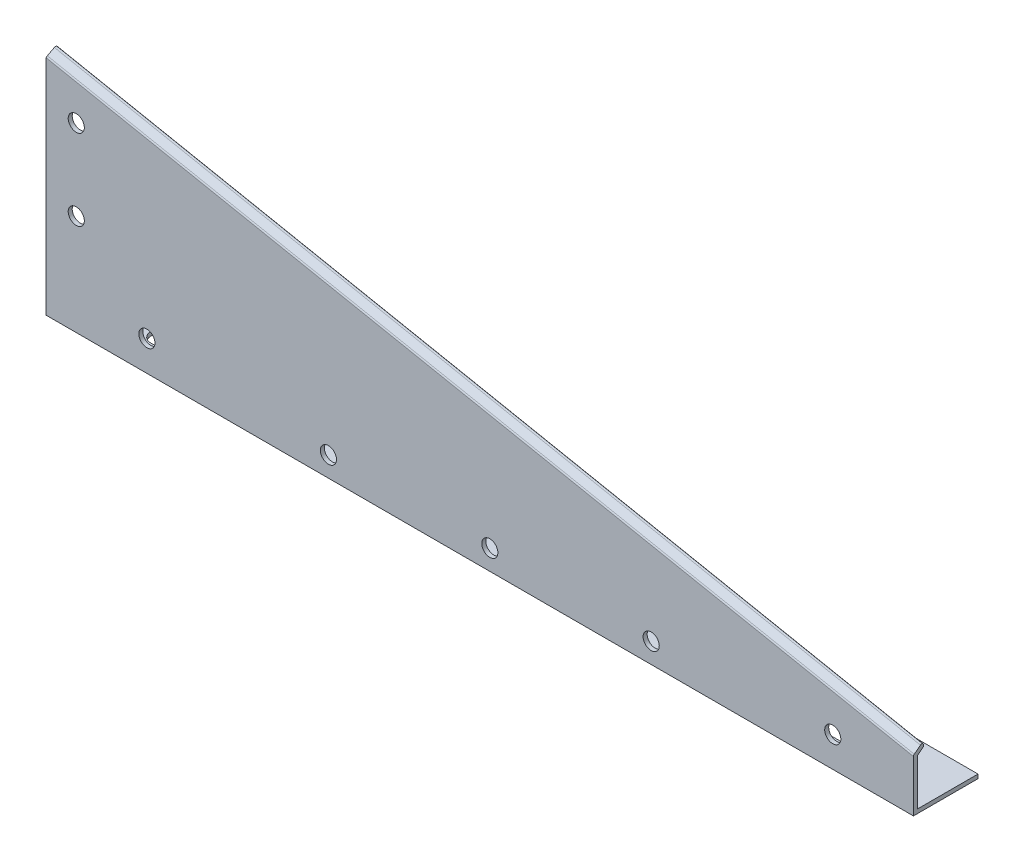
ISO-10303-21;
HEADER;
FILE_DESCRIPTION(('STEP AP214'),'2;1');
FILE_NAME('part.step','',(''),(''),'','','');
FILE_SCHEMA(('AUTOMOTIVE_DESIGN { 1 0 10303 214 1 1 1 1 }'));
ENDSEC;
DATA;
#1=APPLICATION_CONTEXT('core data for automotive mechanical design processes');
#2=APPLICATION_PROTOCOL_DEFINITION('international standard','automotive_design',2000,#1);
#3=PRODUCT_CONTEXT('',#1,'mechanical');
#4=PRODUCT('Part','Part','',(#3));
#5=PRODUCT_RELATED_PRODUCT_CATEGORY('part','',(#4));
#6=PRODUCT_DEFINITION_FORMATION('','',#4);
#7=PRODUCT_DEFINITION_CONTEXT('part definition',#1,'design');
#8=PRODUCT_DEFINITION('design','',#6,#7);
#9=PRODUCT_DEFINITION_SHAPE('','',#8);
#10=(LENGTH_UNIT() NAMED_UNIT(*) SI_UNIT(.MILLI.,.METRE.));
#11=(NAMED_UNIT(*) PLANE_ANGLE_UNIT() SI_UNIT($,.RADIAN.));
#12=(NAMED_UNIT(*) SI_UNIT($,.STERADIAN.) SOLID_ANGLE_UNIT());
#13=UNCERTAINTY_MEASURE_WITH_UNIT(LENGTH_MEASURE(1.E-05),#10,'distance_accuracy_value','');
#14=(GEOMETRIC_REPRESENTATION_CONTEXT(3) GLOBAL_UNCERTAINTY_ASSIGNED_CONTEXT((#13)) GLOBAL_UNIT_ASSIGNED_CONTEXT((#10,
#11,#12)) REPRESENTATION_CONTEXT('',''));
#15=CARTESIAN_POINT('',(0.,0.,0.));
#16=DIRECTION('',(0.,0.,1.));
#17=DIRECTION('',(1.,0.,0.));
#18=AXIS2_PLACEMENT_3D('',#15,#16,#17);
#19=CARTESIAN_POINT('',(0.,0.,0.));
#20=DIRECTION('',(0.,0.,1.));
#21=DIRECTION('',(1.,0.,0.));
#22=AXIS2_PLACEMENT_3D('',#19,#20,#21);
#23=PLANE('',#22);
#24=CARTESIAN_POINT('',(140.,10.,0.));
#25=DIRECTION('',(0.,0.,1.));
#26=DIRECTION('',(1.,0.,0.));
#27=AXIS2_PLACEMENT_3D('',#24,#25,#26);
#28=CIRCLE('',#27,3.99999999999999);
#29=CARTESIAN_POINT('',(144.,10.,0.));
#30=VERTEX_POINT('',#29);
#31=EDGE_CURVE('E214',#30,#30,#28,.T.);
#32=ORIENTED_EDGE('',*,*,#31,.T.);
#33=EDGE_LOOP('',(#32));
#34=FACE_BOUND('',#33,.T.);
#35=CARTESIAN_POINT('',(220.,10.,0.));
#36=DIRECTION('',(0.,0.,1.));
#37=DIRECTION('',(1.,0.,0.));
#38=AXIS2_PLACEMENT_3D('',#35,#36,#37);
#39=CIRCLE('',#38,3.99999999999999);
#40=CARTESIAN_POINT('',(224.,10.,0.));
#41=VERTEX_POINT('',#40);
#42=EDGE_CURVE('E211',#41,#41,#39,.T.);
#43=ORIENTED_EDGE('',*,*,#42,.T.);
#44=EDGE_LOOP('',(#43));
#45=FACE_BOUND('',#44,.T.);
#46=CARTESIAN_POINT('',(300.,10.,0.));
#47=DIRECTION('',(0.,0.,1.));
#48=DIRECTION('',(1.,0.,0.));
#49=AXIS2_PLACEMENT_3D('',#46,#47,#48);
#50=CIRCLE('',#49,3.99999999999999);
#51=CARTESIAN_POINT('',(304.,10.,0.));
#52=VERTEX_POINT('',#51);
#53=EDGE_CURVE('E201',#52,#52,#50,.T.);
#54=ORIENTED_EDGE('',*,*,#53,.T.);
#55=EDGE_LOOP('',(#54));
#56=FACE_BOUND('',#55,.T.);
#57=CARTESIAN_POINT('',(15.,90.,0.));
#58=DIRECTION('',(0.,0.,1.));
#59=DIRECTION('',(1.,0.,0.));
#60=AXIS2_PLACEMENT_3D('',#57,#58,#59);
#61=CIRCLE('',#60,4.);
#62=CARTESIAN_POINT('',(19.,90.,0.));
#63=VERTEX_POINT('',#62);
#64=EDGE_CURVE('E238',#63,#63,#61,.T.);
#65=ORIENTED_EDGE('',*,*,#64,.T.);
#66=EDGE_LOOP('',(#65));
#67=FACE_BOUND('',#66,.T.);
#68=CARTESIAN_POINT('',(390.,15.,0.));
#69=DIRECTION('',(0.,0.,1.));
#70=DIRECTION('',(1.,0.,0.));
#71=AXIS2_PLACEMENT_3D('',#68,#69,#70);
#72=CIRCLE('',#71,3.99999999999999);
#73=CARTESIAN_POINT('',(394.,15.,0.));
#74=VERTEX_POINT('',#73);
#75=EDGE_CURVE('E235',#74,#74,#72,.T.);
#76=ORIENTED_EDGE('',*,*,#75,.T.);
#77=EDGE_LOOP('',(#76));
#78=FACE_BOUND('',#77,.T.);
#79=CARTESIAN_POINT('',(50.,15.,0.));
#80=DIRECTION('',(0.,0.,1.));
#81=DIRECTION('',(1.,0.,0.));
#82=AXIS2_PLACEMENT_3D('',#79,#80,#81);
#83=CIRCLE('',#82,4.00000000000001);
#84=CARTESIAN_POINT('',(54.,15.,0.));
#85=VERTEX_POINT('',#84);
#86=EDGE_CURVE('E232',#85,#85,#83,.T.);
#87=ORIENTED_EDGE('',*,*,#86,.T.);
#88=EDGE_LOOP('',(#87));
#89=FACE_BOUND('',#88,.T.);
#90=CARTESIAN_POINT('',(15.,50.,0.));
#91=DIRECTION('',(0.,0.,1.));
#92=DIRECTION('',(1.,0.,0.));
#93=AXIS2_PLACEMENT_3D('',#90,#91,#92);
#94=CIRCLE('',#93,4.00000000000001);
#95=CARTESIAN_POINT('',(19.,50.,0.));
#96=VERTEX_POINT('',#95);
#97=EDGE_CURVE('E229',#96,#96,#94,.T.);
#98=ORIENTED_EDGE('',*,*,#97,.T.);
#99=EDGE_LOOP('',(#98));
#100=FACE_BOUND('',#99,.T.);
#101=DIRECTION('',(0.,-1.,0.));
#102=VECTOR('',#101,1.);
#103=CARTESIAN_POINT('',(0.,110.,0.));
#104=LINE('',#103,#102);
#105=CARTESIAN_POINT('',(0.,109.490324815257,0.));
#106=VERTEX_POINT('',#105);
#107=CARTESIAN_POINT('',(0.,2.,0.));
#108=VERTEX_POINT('',#107);
#109=EDGE_CURVE('E324',#106,#108,#104,.T.);
#110=ORIENTED_EDGE('',*,*,#109,.F.);
#111=DIRECTION('',(-0.981016959364532,0.193921957083687,0.));
#112=VECTOR('',#111,1.);
#113=CARTESIAN_POINT('',(429.903039021458,24.5094915203177,0.));
#114=LINE('',#113,#112);
#115=CARTESIAN_POINT('',(430.,24.4903248152571,0.));
#116=VERTEX_POINT('',#115);
#117=EDGE_CURVE('E343',#106,#116,#114,.F.);
#118=ORIENTED_EDGE('',*,*,#117,.T.);
#119=DIRECTION('',(0.,1.,0.));
#120=VECTOR('',#119,1.);
#121=CARTESIAN_POINT('',(430.,0.,0.));
#122=LINE('',#121,#120);
#123=CARTESIAN_POINT('',(430.,2.,0.));
#124=VERTEX_POINT('',#123);
#125=EDGE_CURVE('E329',#124,#116,#122,.T.);
#126=ORIENTED_EDGE('',*,*,#125,.F.);
#127=DIRECTION('',(1.,0.,0.));
#128=VECTOR('',#127,1.);
#129=CARTESIAN_POINT('',(430.,2.,0.));
#130=LINE('',#129,#128);
#131=EDGE_CURVE('E305',#108,#124,#130,.T.);
#132=ORIENTED_EDGE('',*,*,#131,.F.);
#133=EDGE_LOOP('',(#110,#118,#126,#132));
#134=FACE_BOUND('',#133,.T.);
#135=ADVANCED_FACE('F33',(#34,#45,#56,#67,#78,#89,#100,#134),#23,.F.);
#136=CARTESIAN_POINT('',(0.,110.,2.));
#137=DIRECTION('',(1.,0.,0.));
#138=DIRECTION('',(0.,1.,0.));
#139=AXIS2_PLACEMENT_3D('',#136,#137,#138);
#140=PLANE('',#139);
#141=DIRECTION('',(0.,0.,-1.));
#142=VECTOR('',#141,1.);
#143=CARTESIAN_POINT('',(0.,110.,2.));
#144=LINE('',#143,#142);
#145=CARTESIAN_POINT('',(0.,110.,2.));
#146=VERTEX_POINT('',#145);
#147=CARTESIAN_POINT('',(0.,110.,-0.133974596215498));
#148=VERTEX_POINT('',#147);
#149=EDGE_CURVE('E48',#146,#148,#144,.T.);
#150=ORIENTED_EDGE('',*,*,#149,.T.);
#151=CARTESIAN_POINT('',(0.,109.490324815257,-1.));
#152=DIRECTION('',(1.,0.,0.));
#153=DIRECTION('',(0.,-1.,0.));
#154=AXIS2_PLACEMENT_3D('',#151,#152,#153);
#155=ELLIPSE('',#154,1.01935036948573,1.);
#156=EDGE_CURVE('E41',#148,#106,#155,.T.);
#157=ORIENTED_EDGE('',*,*,#156,.T.);
#158=ORIENTED_EDGE('',*,*,#109,.T.);
#159=DIRECTION('',(0.,0.,1.));
#160=VECTOR('',#159,1.);
#161=CARTESIAN_POINT('',(0.,2.,-30.));
#162=LINE('',#161,#160);
#163=CARTESIAN_POINT('',(0.,2.,-30.));
#164=VERTEX_POINT('',#163);
#165=EDGE_CURVE('E321',#164,#108,#162,.T.);
#166=ORIENTED_EDGE('',*,*,#165,.F.);
#167=DIRECTION('',(0.,1.,0.));
#168=VECTOR('',#167,1.);
#169=CARTESIAN_POINT('',(0.,0.,-30.));
#170=LINE('',#169,#168);
#171=CARTESIAN_POINT('',(0.,0.,-30.));
#172=VERTEX_POINT('',#171);
#173=EDGE_CURVE('E312',#172,#164,#170,.T.);
#174=ORIENTED_EDGE('',*,*,#173,.F.);
#175=DIRECTION('',(0.,0.,-1.));
#176=VECTOR('',#175,1.);
#177=CARTESIAN_POINT('',(0.,0.,2.));
#178=LINE('',#177,#176);
#179=CARTESIAN_POINT('',(0.,0.,2.));
#180=VERTEX_POINT('',#179);
#181=EDGE_CURVE('E340',#180,#172,#178,.T.);
#182=ORIENTED_EDGE('',*,*,#181,.F.);
#183=DIRECTION('',(0.,-1.,0.));
#184=VECTOR('',#183,1.);
#185=CARTESIAN_POINT('',(0.,110.,2.));
#186=LINE('',#185,#184);
#187=EDGE_CURVE('E325',#146,#180,#186,.T.);
#188=ORIENTED_EDGE('',*,*,#187,.F.);
#189=EDGE_LOOP('',(#150,#157,#158,#166,#174,#182,#188));
#190=FACE_BOUND('',#189,.T.);
#191=ADVANCED_FACE('F356',(#190),#140,.F.);
#192=CARTESIAN_POINT('',(0.,0.,2.));
#193=DIRECTION('',(0.,1.,0.));
#194=DIRECTION('',(0.,0.,1.));
#195=AXIS2_PLACEMENT_3D('',#192,#193,#194);
#196=PLANE('',#195);
#197=DIRECTION('',(-1.,0.,0.));
#198=VECTOR('',#197,1.);
#199=CARTESIAN_POINT('',(0.,0.,-20.));
#200=LINE('',#199,#198);
#201=CARTESIAN_POINT('',(120.,0.,-20.));
#202=VERTEX_POINT('',#201);
#203=CARTESIAN_POINT('',(40.,0.,-20.));
#204=VERTEX_POINT('',#203);
#205=EDGE_CURVE('E299',#202,#204,#200,.T.);
#206=ORIENTED_EDGE('',*,*,#205,.T.);
#207=CARTESIAN_POINT('',(40.,0.,-15.));
#208=DIRECTION('',(0.,1.,0.));
#209=DIRECTION('',(0.,0.,1.));
#210=AXIS2_PLACEMENT_3D('',#207,#208,#209);
#211=CIRCLE('',#210,4.99999999999989);
#212=CARTESIAN_POINT('',(40.,0.,-10.0000000000002));
#213=VERTEX_POINT('',#212);
#214=EDGE_CURVE('E302',#204,#213,#211,.T.);
#215=ORIENTED_EDGE('',*,*,#214,.T.);
#216=DIRECTION('',(1.,0.,0.));
#217=VECTOR('',#216,1.);
#218=CARTESIAN_POINT('',(0.,0.,-10.0000000000003));
#219=LINE('',#218,#217);
#220=CARTESIAN_POINT('',(120.,0.,-10.0000000000001));
#221=VERTEX_POINT('',#220);
#222=EDGE_CURVE('E293',#213,#221,#219,.T.);
#223=ORIENTED_EDGE('',*,*,#222,.T.);
#224=CARTESIAN_POINT('',(120.,0.,-15.));
#225=DIRECTION('',(0.,1.,0.));
#226=DIRECTION('',(0.,0.,1.));
#227=AXIS2_PLACEMENT_3D('',#224,#225,#226);
#228=CIRCLE('',#227,4.99999999999993);
#229=EDGE_CURVE('E296',#221,#202,#228,.T.);
#230=ORIENTED_EDGE('',*,*,#229,.T.);
#231=EDGE_LOOP('',(#206,#215,#223,#230));
#232=FACE_BOUND('',#231,.T.);
#233=DIRECTION('',(1.,0.,0.));
#234=VECTOR('',#233,1.);
#235=CARTESIAN_POINT('',(0.,0.,-9.99999999999986));
#236=LINE('',#235,#234);
#237=CARTESIAN_POINT('',(310.,0.,-10.0000000000001));
#238=VERTEX_POINT('',#237);
#239=CARTESIAN_POINT('',(390.,0.,-10.0000000000002));
#240=VERTEX_POINT('',#239);
#241=EDGE_CURVE('E287',#238,#240,#236,.T.);
#242=ORIENTED_EDGE('',*,*,#241,.T.);
#243=CARTESIAN_POINT('',(390.,0.,-15.));
#244=DIRECTION('',(0.,1.,0.));
#245=DIRECTION('',(0.,0.,1.));
#246=AXIS2_PLACEMENT_3D('',#243,#244,#245);
#247=CIRCLE('',#246,4.99999999999989);
#248=CARTESIAN_POINT('',(390.,0.,-20.));
#249=VERTEX_POINT('',#248);
#250=EDGE_CURVE('E290',#240,#249,#247,.T.);
#251=ORIENTED_EDGE('',*,*,#250,.T.);
#252=DIRECTION('',(-1.,0.,0.));
#253=VECTOR('',#252,1.);
#254=CARTESIAN_POINT('',(0.,0.,-20.));
#255=LINE('',#254,#253);
#256=CARTESIAN_POINT('',(310.,0.,-20.));
#257=VERTEX_POINT('',#256);
#258=EDGE_CURVE('E257',#249,#257,#255,.T.);
#259=ORIENTED_EDGE('',*,*,#258,.T.);
#260=CARTESIAN_POINT('',(310.,0.,-15.));
#261=DIRECTION('',(0.,1.,0.));
#262=DIRECTION('',(0.,0.,1.));
#263=AXIS2_PLACEMENT_3D('',#260,#261,#262);
#264=CIRCLE('',#263,4.99999999999993);
#265=EDGE_CURVE('E284',#257,#238,#264,.T.);
#266=ORIENTED_EDGE('',*,*,#265,.T.);
#267=EDGE_LOOP('',(#242,#251,#259,#266));
#268=FACE_BOUND('',#267,.T.);
#269=ORIENTED_EDGE('',*,*,#181,.T.);
#270=DIRECTION('',(-1.,0.,0.));
#271=VECTOR('',#270,1.);
#272=CARTESIAN_POINT('',(430.,0.,-30.));
#273=LINE('',#272,#271);
#274=CARTESIAN_POINT('',(430.,0.,-30.));
#275=VERTEX_POINT('',#274);
#276=EDGE_CURVE('E309',#275,#172,#273,.T.);
#277=ORIENTED_EDGE('',*,*,#276,.F.);
#278=DIRECTION('',(0.,0.,-1.));
#279=VECTOR('',#278,1.);
#280=CARTESIAN_POINT('',(430.,0.,2.));
#281=LINE('',#280,#279);
#282=CARTESIAN_POINT('',(430.,0.,2.));
#283=VERTEX_POINT('',#282);
#284=EDGE_CURVE('E338',#283,#275,#281,.T.);
#285=ORIENTED_EDGE('',*,*,#284,.F.);
#286=DIRECTION('',(1.,0.,0.));
#287=VECTOR('',#286,1.);
#288=CARTESIAN_POINT('',(0.,0.,2.));
#289=LINE('',#288,#287);
#290=EDGE_CURVE('E328',#180,#283,#289,.T.);
#291=ORIENTED_EDGE('',*,*,#290,.F.);
#292=EDGE_LOOP('',(#269,#277,#285,#291));
#293=FACE_BOUND('',#292,.T.);
#294=ADVANCED_FACE('F375',(#232,#268,#293),#196,.F.);
#295=CARTESIAN_POINT('',(430.,0.,2.));
#296=DIRECTION('',(-1.,0.,0.));
#297=DIRECTION('',(0.,0.,1.));
#298=AXIS2_PLACEMENT_3D('',#295,#296,#297);
#299=PLANE('',#298);
#300=DIRECTION('',(0.,0.607353301341569,-0.794431851922805));
#301=VECTOR('',#300,1.);
#302=CARTESIAN_POINT('',(430.,25.5744944872025,2.58188155332394));
#303=LINE('',#302,#301);
#304=CARTESIAN_POINT('',(430.,26.3251554803314,1.6));
#305=VERTEX_POINT('',#304);
#306=CARTESIAN_POINT('',(430.,28.671038516351,-1.46846805736095));
#307=VERTEX_POINT('',#306);
#308=EDGE_CURVE('E186',#305,#307,#303,.T.);
#309=ORIENTED_EDGE('',*,*,#308,.F.);
#310=CARTESIAN_POINT('',(430.,25.5096751847429,1.));
#311=DIRECTION('',(-1.,0.,0.));
#312=DIRECTION('',(0.,-1.,0.));
#313=AXIS2_PLACEMENT_3D('',#310,#311,#312);
#314=ELLIPSE('',#313,1.01935036948573,1.);
#315=CARTESIAN_POINT('',(430.,25.5096751847429,2.));
#316=VERTEX_POINT('',#315);
#317=EDGE_CURVE('E351',#305,#316,#314,.F.);
#318=ORIENTED_EDGE('',*,*,#317,.T.);
#319=DIRECTION('',(0.,1.,0.));
#320=VECTOR('',#319,1.);
#321=CARTESIAN_POINT('',(430.,0.,2.));
#322=LINE('',#321,#320);
#323=EDGE_CURVE('E331',#283,#316,#322,.T.);
#324=ORIENTED_EDGE('',*,*,#323,.F.);
#325=ORIENTED_EDGE('',*,*,#284,.T.);
#326=DIRECTION('',(0.,-1.,0.));
#327=VECTOR('',#326,1.);
#328=CARTESIAN_POINT('',(430.,0.,-30.));
#329=LINE('',#328,#327);
#330=CARTESIAN_POINT('',(430.,2.,-30.));
#331=VERTEX_POINT('',#330);
#332=EDGE_CURVE('E306',#331,#275,#329,.T.);
#333=ORIENTED_EDGE('',*,*,#332,.F.);
#334=DIRECTION('',(0.,0.,1.));
#335=VECTOR('',#334,1.);
#336=CARTESIAN_POINT('',(430.,2.,-30.));
#337=LINE('',#336,#335);
#338=EDGE_CURVE('E316',#331,#124,#337,.T.);
#339=ORIENTED_EDGE('',*,*,#338,.T.);
#340=ORIENTED_EDGE('',*,*,#125,.T.);
#341=CARTESIAN_POINT('',(430.,24.4903248152571,-1.));
#342=DIRECTION('',(-1.,0.,0.));
#343=DIRECTION('',(0.,-1.,0.));
#344=AXIS2_PLACEMENT_3D('',#341,#342,#343);
#345=ELLIPSE('',#344,1.01935036948573,1.);
#346=CARTESIAN_POINT('',(430.,25.3058051108457,-0.399999999999989));
#347=VERTEX_POINT('',#346);
#348=EDGE_CURVE('E11',#116,#347,#345,.T.);
#349=ORIENTED_EDGE('',*,*,#348,.T.);
#350=DIRECTION('',(0.,-0.607353301341571,0.794431851922803));
#351=VECTOR('',#350,1.);
#352=CARTESIAN_POINT('',(430.,26.5810625857552,-2.06806561392338));
#353=LINE('',#352,#351);
#354=CARTESIAN_POINT('',(430.,27.0400779251739,-2.66846805736096));
#355=VERTEX_POINT('',#354);
#356=EDGE_CURVE('E208',#355,#347,#353,.T.);
#357=ORIENTED_EDGE('',*,*,#356,.F.);
#358=CARTESIAN_POINT('',(430.,27.8555582207625,-2.06846805736096));
#359=DIRECTION('',(-1.,0.,0.));
#360=DIRECTION('',(0.,1.,0.));
#361=AXIS2_PLACEMENT_3D('',#358,#359,#360);
#362=ELLIPSE('',#361,1.01935036948573,1.);
#363=EDGE_CURVE('E185',#307,#355,#362,.T.);
#364=ORIENTED_EDGE('',*,*,#363,.F.);
#365=EDGE_LOOP('',(#309,#318,#324,#325,#333,#339,#340,#349,#357,#364));
#366=FACE_BOUND('',#365,.T.);
#367=ADVANCED_FACE('F365',(#366),#299,.F.);
#368=CARTESIAN_POINT('',(0.,0.,2.));
#369=DIRECTION('',(0.,0.,1.));
#370=DIRECTION('',(1.,0.,0.));
#371=AXIS2_PLACEMENT_3D('',#368,#369,#370);
#372=PLANE('',#371);
#373=CARTESIAN_POINT('',(140.,10.,2.));
#374=DIRECTION('',(0.,0.,1.));
#375=DIRECTION('',(1.,0.,0.));
#376=AXIS2_PLACEMENT_3D('',#373,#374,#375);
#377=CIRCLE('',#376,3.99999999999999);
#378=CARTESIAN_POINT('',(144.,10.,2.));
#379=VERTEX_POINT('',#378);
#380=EDGE_CURVE('E198',#379,#379,#377,.T.);
#381=ORIENTED_EDGE('',*,*,#380,.F.);
#382=EDGE_LOOP('',(#381));
#383=FACE_BOUND('',#382,.T.);
#384=CARTESIAN_POINT('',(220.,10.,2.));
#385=DIRECTION('',(0.,0.,1.));
#386=DIRECTION('',(1.,0.,0.));
#387=AXIS2_PLACEMENT_3D('',#384,#385,#386);
#388=CIRCLE('',#387,3.99999999999999);
#389=CARTESIAN_POINT('',(224.,10.,2.));
#390=VERTEX_POINT('',#389);
#391=EDGE_CURVE('E202',#390,#390,#388,.T.);
#392=ORIENTED_EDGE('',*,*,#391,.F.);
#393=EDGE_LOOP('',(#392));
#394=FACE_BOUND('',#393,.T.);
#395=CARTESIAN_POINT('',(300.,10.,2.));
#396=DIRECTION('',(0.,0.,1.));
#397=DIRECTION('',(1.,0.,0.));
#398=AXIS2_PLACEMENT_3D('',#395,#396,#397);
#399=CIRCLE('',#398,3.99999999999999);
#400=CARTESIAN_POINT('',(304.,10.,2.));
#401=VERTEX_POINT('',#400);
#402=EDGE_CURVE('E205',#401,#401,#399,.T.);
#403=ORIENTED_EDGE('',*,*,#402,.F.);
#404=EDGE_LOOP('',(#403));
#405=FACE_BOUND('',#404,.T.);
#406=CARTESIAN_POINT('',(15.,90.,2.));
#407=DIRECTION('',(0.,0.,1.));
#408=DIRECTION('',(1.,0.,0.));
#409=AXIS2_PLACEMENT_3D('',#406,#407,#408);
#410=CIRCLE('',#409,4.);
#411=CARTESIAN_POINT('',(19.,90.,2.));
#412=VERTEX_POINT('',#411);
#413=EDGE_CURVE('E217',#412,#412,#410,.T.);
#414=ORIENTED_EDGE('',*,*,#413,.F.);
#415=EDGE_LOOP('',(#414));
#416=FACE_BOUND('',#415,.T.);
#417=CARTESIAN_POINT('',(390.,15.,2.));
#418=DIRECTION('',(0.,0.,1.));
#419=DIRECTION('',(1.,0.,0.));
#420=AXIS2_PLACEMENT_3D('',#417,#418,#419);
#421=CIRCLE('',#420,3.99999999999999);
#422=CARTESIAN_POINT('',(394.,15.,2.));
#423=VERTEX_POINT('',#422);
#424=EDGE_CURVE('E222',#423,#423,#421,.T.);
#425=ORIENTED_EDGE('',*,*,#424,.F.);
#426=EDGE_LOOP('',(#425));
#427=FACE_BOUND('',#426,.T.);
#428=CARTESIAN_POINT('',(50.,15.,2.));
#429=DIRECTION('',(0.,0.,1.));
#430=DIRECTION('',(1.,0.,0.));
#431=AXIS2_PLACEMENT_3D('',#428,#429,#430);
#432=CIRCLE('',#431,4.00000000000001);
#433=CARTESIAN_POINT('',(54.,15.,2.));
#434=VERTEX_POINT('',#433);
#435=EDGE_CURVE('E218',#434,#434,#432,.T.);
#436=ORIENTED_EDGE('',*,*,#435,.F.);
#437=EDGE_LOOP('',(#436));
#438=FACE_BOUND('',#437,.T.);
#439=CARTESIAN_POINT('',(15.,50.,2.));
#440=DIRECTION('',(0.,0.,1.));
#441=DIRECTION('',(1.,0.,0.));
#442=AXIS2_PLACEMENT_3D('',#439,#440,#441);
#443=CIRCLE('',#442,4.00000000000001);
#444=CARTESIAN_POINT('',(19.,50.,2.));
#445=VERTEX_POINT('',#444);
#446=EDGE_CURVE('E221',#445,#445,#443,.T.);
#447=ORIENTED_EDGE('',*,*,#446,.F.);
#448=EDGE_LOOP('',(#447));
#449=FACE_BOUND('',#448,.T.);
#450=ORIENTED_EDGE('',*,*,#323,.T.);
#451=DIRECTION('',(-0.981016959364532,0.193921957083687,0.));
#452=VECTOR('',#451,1.);
#453=CARTESIAN_POINT('',(0.0969609785418449,110.490508479682,2.));
#454=LINE('',#453,#452);
#455=CARTESIAN_POINT('',(0.0969609785418449,110.490508479682,2.));
#456=VERTEX_POINT('',#455);
#457=EDGE_CURVE('E345',#316,#456,#454,.T.);
#458=ORIENTED_EDGE('',*,*,#457,.T.);
#459=DIRECTION('',(-0.193921957083689,-0.981016959364532,0.));
#460=VECTOR('',#459,1.);
#461=CARTESIAN_POINT('',(0.,110.,2.));
#462=LINE('',#461,#460);
#463=EDGE_CURVE('E177',#456,#146,#462,.T.);
#464=ORIENTED_EDGE('',*,*,#463,.T.);
#465=ORIENTED_EDGE('',*,*,#187,.T.);
#466=ORIENTED_EDGE('',*,*,#290,.T.);
#467=EDGE_LOOP('',(#450,#458,#464,#465,#466));
#468=FACE_BOUND('',#467,.T.);
#469=ADVANCED_FACE('F369',(#383,#394,#405,#416,#427,#438,#449,#468),#372,.T.);
#470=CARTESIAN_POINT('',(430.,2.,-30.));
#471=DIRECTION('',(0.,-1.,0.));
#472=DIRECTION('',(1.,0.,0.));
#473=AXIS2_PLACEMENT_3D('',#470,#471,#472);
#474=PLANE('',#473);
#475=DIRECTION('',(1.,0.,0.));
#476=VECTOR('',#475,1.);
#477=CARTESIAN_POINT('',(40.,2.,-10.0000000000002));
#478=LINE('',#477,#476);
#479=CARTESIAN_POINT('',(39.9999999999999,2.,-10.0000000000002));
#480=VERTEX_POINT('',#479);
#481=CARTESIAN_POINT('',(120.,2.,-10.0000000000001));
#482=VERTEX_POINT('',#481);
#483=EDGE_CURVE('E244',#480,#482,#478,.T.);
#484=ORIENTED_EDGE('',*,*,#483,.F.);
#485=CARTESIAN_POINT('',(40.,2.,-15.));
#486=DIRECTION('',(0.,1.,0.));
#487=DIRECTION('',(-1.,0.,0.));
#488=AXIS2_PLACEMENT_3D('',#485,#486,#487);
#489=CIRCLE('',#488,4.99999999999989);
#490=CARTESIAN_POINT('',(40.,2.,-20.));
#491=VERTEX_POINT('',#490);
#492=EDGE_CURVE('E242',#491,#480,#489,.T.);
#493=ORIENTED_EDGE('',*,*,#492,.F.);
#494=DIRECTION('',(-1.,0.,0.));
#495=VECTOR('',#494,1.);
#496=CARTESIAN_POINT('',(40.,2.,-20.));
#497=LINE('',#496,#495);
#498=CARTESIAN_POINT('',(120.,2.,-20.));
#499=VERTEX_POINT('',#498);
#500=EDGE_CURVE('E251',#499,#491,#497,.T.);
#501=ORIENTED_EDGE('',*,*,#500,.F.);
#502=CARTESIAN_POINT('',(120.,2.,-15.));
#503=DIRECTION('',(0.,1.,0.));
#504=DIRECTION('',(-1.,0.,0.));
#505=AXIS2_PLACEMENT_3D('',#502,#503,#504);
#506=CIRCLE('',#505,4.99999999999993);
#507=EDGE_CURVE('E248',#482,#499,#506,.T.);
#508=ORIENTED_EDGE('',*,*,#507,.F.);
#509=EDGE_LOOP('',(#484,#493,#501,#508));
#510=FACE_BOUND('',#509,.T.);
#511=DIRECTION('',(-1.,0.,0.));
#512=VECTOR('',#511,1.);
#513=CARTESIAN_POINT('',(390.,2.,-20.));
#514=LINE('',#513,#512);
#515=CARTESIAN_POINT('',(390.,2.,-20.));
#516=VERTEX_POINT('',#515);
#517=CARTESIAN_POINT('',(310.,2.,-20.));
#518=VERTEX_POINT('',#517);
#519=EDGE_CURVE('E265',#516,#518,#514,.T.);
#520=ORIENTED_EDGE('',*,*,#519,.F.);
#521=CARTESIAN_POINT('',(390.,2.,-15.));
#522=DIRECTION('',(0.,1.,0.));
#523=DIRECTION('',(1.,0.,0.));
#524=AXIS2_PLACEMENT_3D('',#521,#522,#523);
#525=CIRCLE('',#524,4.99999999999989);
#526=CARTESIAN_POINT('',(390.,2.,-10.0000000000002));
#527=VERTEX_POINT('',#526);
#528=EDGE_CURVE('E241',#527,#516,#525,.T.);
#529=ORIENTED_EDGE('',*,*,#528,.F.);
#530=DIRECTION('',(1.,0.,0.));
#531=VECTOR('',#530,1.);
#532=CARTESIAN_POINT('',(390.,2.,-10.0000000000002));
#533=LINE('',#532,#531);
#534=CARTESIAN_POINT('',(310.,2.,-10.0000000000001));
#535=VERTEX_POINT('',#534);
#536=EDGE_CURVE('E271',#535,#527,#533,.T.);
#537=ORIENTED_EDGE('',*,*,#536,.F.);
#538=CARTESIAN_POINT('',(310.,2.,-15.));
#539=DIRECTION('',(0.,1.,0.));
#540=DIRECTION('',(1.,0.,0.));
#541=AXIS2_PLACEMENT_3D('',#538,#539,#540);
#542=CIRCLE('',#541,4.99999999999993);
#543=EDGE_CURVE('E268',#518,#535,#542,.T.);
#544=ORIENTED_EDGE('',*,*,#543,.F.);
#545=EDGE_LOOP('',(#520,#529,#537,#544));
#546=FACE_BOUND('',#545,.T.);
#547=ORIENTED_EDGE('',*,*,#131,.T.);
#548=ORIENTED_EDGE('',*,*,#338,.F.);
#549=DIRECTION('',(1.,0.,0.));
#550=VECTOR('',#549,1.);
#551=CARTESIAN_POINT('',(430.,2.,-30.));
#552=LINE('',#551,#550);
#553=EDGE_CURVE('E314',#164,#331,#552,.T.);
#554=ORIENTED_EDGE('',*,*,#553,.F.);
#555=ORIENTED_EDGE('',*,*,#165,.T.);
#556=EDGE_LOOP('',(#547,#548,#554,#555));
#557=FACE_BOUND('',#556,.T.);
#558=ADVANCED_FACE('F479',(#510,#546,#557),#474,.F.);
#559=CARTESIAN_POINT('',(0.,0.,-30.));
#560=DIRECTION('',(0.,0.,1.));
#561=DIRECTION('',(1.,0.,0.));
#562=AXIS2_PLACEMENT_3D('',#559,#560,#561);
#563=PLANE('',#562);
#564=ORIENTED_EDGE('',*,*,#332,.T.);
#565=ORIENTED_EDGE('',*,*,#276,.T.);
#566=ORIENTED_EDGE('',*,*,#173,.T.);
#567=ORIENTED_EDGE('',*,*,#553,.T.);
#568=EDGE_LOOP('',(#564,#565,#566,#567));
#569=FACE_BOUND('',#568,.T.);
#570=ADVANCED_FACE('F378',(#569),#563,.F.);
#571=CARTESIAN_POINT('',(390.,-48.,-15.));
#572=DIRECTION('',(0.,1.,0.));
#573=DIRECTION('',(-1.,0.,0.));
#574=AXIS2_PLACEMENT_3D('',#571,#572,#573);
#575=CYLINDRICAL_SURFACE('',#574,4.99999999999989);
#576=DIRECTION('',(0.,1.,0.));
#577=VECTOR('',#576,1.);
#578=CARTESIAN_POINT('',(390.,-48.,-10.0000000000002));
#579=LINE('',#578,#577);
#580=EDGE_CURVE('E245',#240,#527,#579,.T.);
#581=ORIENTED_EDGE('',*,*,#580,.T.);
#582=ORIENTED_EDGE('',*,*,#528,.T.);
#583=DIRECTION('',(0.,1.,0.));
#584=VECTOR('',#583,1.);
#585=CARTESIAN_POINT('',(390.,-48.,-20.));
#586=LINE('',#585,#584);
#587=EDGE_CURVE('E274',#249,#516,#586,.T.);
#588=ORIENTED_EDGE('',*,*,#587,.F.);
#589=ORIENTED_EDGE('',*,*,#250,.F.);
#590=EDGE_LOOP('',(#581,#582,#588,#589));
#591=FACE_BOUND('',#590,.T.);
#592=ADVANCED_FACE('F467',(#591),#575,.F.);
#593=CARTESIAN_POINT('',(390.,-48.,-10.0000000000002));
#594=DIRECTION('',(0.,0.,1.));
#595=DIRECTION('',(1.,0.,0.));
#596=AXIS2_PLACEMENT_3D('',#593,#594,#595);
#597=PLANE('',#596);
#598=DIRECTION('',(0.,1.,0.));
#599=VECTOR('',#598,1.);
#600=CARTESIAN_POINT('',(310.,-48.,-10.0000000000001));
#601=LINE('',#600,#599);
#602=EDGE_CURVE('E276',#238,#535,#601,.T.);
#603=ORIENTED_EDGE('',*,*,#602,.T.);
#604=ORIENTED_EDGE('',*,*,#536,.T.);
#605=ORIENTED_EDGE('',*,*,#580,.F.);
#606=ORIENTED_EDGE('',*,*,#241,.F.);
#607=EDGE_LOOP('',(#603,#604,#605,#606));
#608=FACE_BOUND('',#607,.T.);
#609=ADVANCED_FACE('F463',(#608),#597,.F.);
#610=CARTESIAN_POINT('',(310.,-48.,-15.));
#611=DIRECTION('',(0.,1.,0.));
#612=DIRECTION('',(-1.,0.,0.));
#613=AXIS2_PLACEMENT_3D('',#610,#611,#612);
#614=CYLINDRICAL_SURFACE('',#613,4.99999999999993);
#615=DIRECTION('',(0.,1.,0.));
#616=VECTOR('',#615,1.);
#617=CARTESIAN_POINT('',(310.,-48.,-20.));
#618=LINE('',#617,#616);
#619=EDGE_CURVE('E278',#257,#518,#618,.T.);
#620=ORIENTED_EDGE('',*,*,#619,.T.);
#621=ORIENTED_EDGE('',*,*,#543,.T.);
#622=ORIENTED_EDGE('',*,*,#602,.F.);
#623=ORIENTED_EDGE('',*,*,#265,.F.);
#624=EDGE_LOOP('',(#620,#621,#622,#623));
#625=FACE_BOUND('',#624,.T.);
#626=ADVANCED_FACE('F466',(#625),#614,.F.);
#627=CARTESIAN_POINT('',(390.,-48.,-20.));
#628=DIRECTION('',(0.,0.,-1.));
#629=DIRECTION('',(-1.,0.,0.));
#630=AXIS2_PLACEMENT_3D('',#627,#628,#629);
#631=PLANE('',#630);
#632=ORIENTED_EDGE('',*,*,#587,.T.);
#633=ORIENTED_EDGE('',*,*,#519,.T.);
#634=ORIENTED_EDGE('',*,*,#619,.F.);
#635=ORIENTED_EDGE('',*,*,#258,.F.);
#636=EDGE_LOOP('',(#632,#633,#634,#635));
#637=FACE_BOUND('',#636,.T.);
#638=ADVANCED_FACE('F461',(#637),#631,.F.);
#639=CARTESIAN_POINT('',(40.,-48.,-15.));
#640=DIRECTION('',(0.,1.,0.));
#641=DIRECTION('',(-1.,0.,0.));
#642=AXIS2_PLACEMENT_3D('',#639,#640,#641);
#643=CYLINDRICAL_SURFACE('',#642,4.99999999999989);
#644=DIRECTION('',(0.,1.,0.));
#645=VECTOR('',#644,1.);
#646=CARTESIAN_POINT('',(40.,-48.,-20.));
#647=LINE('',#646,#645);
#648=EDGE_CURVE('E255',#204,#491,#647,.T.);
#649=ORIENTED_EDGE('',*,*,#648,.T.);
#650=ORIENTED_EDGE('',*,*,#492,.T.);
#651=DIRECTION('',(0.,1.,0.));
#652=VECTOR('',#651,1.);
#653=CARTESIAN_POINT('',(40.,-48.,-10.0000000000002));
#654=LINE('',#653,#652);
#655=EDGE_CURVE('E254',#213,#480,#654,.T.);
#656=ORIENTED_EDGE('',*,*,#655,.F.);
#657=ORIENTED_EDGE('',*,*,#214,.F.);
#658=EDGE_LOOP('',(#649,#650,#656,#657));
#659=FACE_BOUND('',#658,.T.);
#660=ADVANCED_FACE('F451',(#659),#643,.F.);
#661=CARTESIAN_POINT('',(40.,-48.,-20.));
#662=DIRECTION('',(0.,0.,-1.));
#663=DIRECTION('',(-1.,0.,0.));
#664=AXIS2_PLACEMENT_3D('',#661,#662,#663);
#665=PLANE('',#664);
#666=DIRECTION('',(0.,1.,0.));
#667=VECTOR('',#666,1.);
#668=CARTESIAN_POINT('',(120.,-48.,-20.));
#669=LINE('',#668,#667);
#670=EDGE_CURVE('E258',#202,#499,#669,.T.);
#671=ORIENTED_EDGE('',*,*,#670,.T.);
#672=ORIENTED_EDGE('',*,*,#500,.T.);
#673=ORIENTED_EDGE('',*,*,#648,.F.);
#674=ORIENTED_EDGE('',*,*,#205,.F.);
#675=EDGE_LOOP('',(#671,#672,#673,#674));
#676=FACE_BOUND('',#675,.T.);
#677=ADVANCED_FACE('F447',(#676),#665,.F.);
#678=CARTESIAN_POINT('',(120.,-48.,-15.));
#679=DIRECTION('',(0.,1.,0.));
#680=DIRECTION('',(-1.,0.,0.));
#681=AXIS2_PLACEMENT_3D('',#678,#679,#680);
#682=CYLINDRICAL_SURFACE('',#681,4.99999999999993);
#683=DIRECTION('',(0.,1.,0.));
#684=VECTOR('',#683,1.);
#685=CARTESIAN_POINT('',(120.,-48.,-10.0000000000001));
#686=LINE('',#685,#684);
#687=EDGE_CURVE('E260',#221,#482,#686,.T.);
#688=ORIENTED_EDGE('',*,*,#687,.T.);
#689=ORIENTED_EDGE('',*,*,#507,.T.);
#690=ORIENTED_EDGE('',*,*,#670,.F.);
#691=ORIENTED_EDGE('',*,*,#229,.F.);
#692=EDGE_LOOP('',(#688,#689,#690,#691));
#693=FACE_BOUND('',#692,.T.);
#694=ADVANCED_FACE('F450',(#693),#682,.F.);
#695=CARTESIAN_POINT('',(40.,-48.,-10.0000000000002));
#696=DIRECTION('',(0.,0.,1.));
#697=DIRECTION('',(1.,0.,0.));
#698=AXIS2_PLACEMENT_3D('',#695,#696,#697);
#699=PLANE('',#698);
#700=ORIENTED_EDGE('',*,*,#655,.T.);
#701=ORIENTED_EDGE('',*,*,#483,.T.);
#702=ORIENTED_EDGE('',*,*,#687,.F.);
#703=ORIENTED_EDGE('',*,*,#222,.F.);
#704=EDGE_LOOP('',(#700,#701,#702,#703));
#705=FACE_BOUND('',#704,.T.);
#706=ADVANCED_FACE('F445',(#705),#699,.F.);
#707=CARTESIAN_POINT('',(15.,50.,-30.));
#708=DIRECTION('',(0.,0.,1.));
#709=DIRECTION('',(1.,0.,0.));
#710=AXIS2_PLACEMENT_3D('',#707,#708,#709);
#711=CYLINDRICAL_SURFACE('',#710,4.00000000000001);
#712=ORIENTED_EDGE('',*,*,#446,.T.);
#713=EDGE_LOOP('',(#712));
#714=FACE_BOUND('',#713,.T.);
#715=ORIENTED_EDGE('',*,*,#97,.F.);
#716=EDGE_LOOP('',(#715));
#717=FACE_BOUND('',#716,.T.);
#718=ADVANCED_FACE('F435',(#714,#717),#711,.F.);
#719=CARTESIAN_POINT('',(50.,15.,-30.));
#720=DIRECTION('',(0.,0.,1.));
#721=DIRECTION('',(1.,0.,0.));
#722=AXIS2_PLACEMENT_3D('',#719,#720,#721);
#723=CYLINDRICAL_SURFACE('',#722,4.00000000000001);
#724=ORIENTED_EDGE('',*,*,#435,.T.);
#725=EDGE_LOOP('',(#724));
#726=FACE_BOUND('',#725,.T.);
#727=ORIENTED_EDGE('',*,*,#86,.F.);
#728=EDGE_LOOP('',(#727));
#729=FACE_BOUND('',#728,.T.);
#730=ADVANCED_FACE('F431',(#726,#729),#723,.F.);
#731=CARTESIAN_POINT('',(390.,15.,-30.));
#732=DIRECTION('',(0.,0.,1.));
#733=DIRECTION('',(1.,0.,0.));
#734=AXIS2_PLACEMENT_3D('',#731,#732,#733);
#735=CYLINDRICAL_SURFACE('',#734,3.99999999999999);
#736=ORIENTED_EDGE('',*,*,#424,.T.);
#737=EDGE_LOOP('',(#736));
#738=FACE_BOUND('',#737,.T.);
#739=ORIENTED_EDGE('',*,*,#75,.F.);
#740=EDGE_LOOP('',(#739));
#741=FACE_BOUND('',#740,.T.);
#742=ADVANCED_FACE('F434',(#738,#741),#735,.F.);
#743=CARTESIAN_POINT('',(15.,90.,-30.));
#744=DIRECTION('',(0.,0.,1.));
#745=DIRECTION('',(1.,0.,0.));
#746=AXIS2_PLACEMENT_3D('',#743,#744,#745);
#747=CYLINDRICAL_SURFACE('',#746,4.);
#748=ORIENTED_EDGE('',*,*,#413,.T.);
#749=EDGE_LOOP('',(#748));
#750=FACE_BOUND('',#749,.T.);
#751=ORIENTED_EDGE('',*,*,#64,.F.);
#752=EDGE_LOOP('',(#751));
#753=FACE_BOUND('',#752,.T.);
#754=ADVANCED_FACE('F429',(#750,#753),#747,.F.);
#755=CARTESIAN_POINT('',(300.,10.,-30.));
#756=DIRECTION('',(0.,0.,1.));
#757=DIRECTION('',(1.,0.,0.));
#758=AXIS2_PLACEMENT_3D('',#755,#756,#757);
#759=CYLINDRICAL_SURFACE('',#758,3.99999999999999);
#760=ORIENTED_EDGE('',*,*,#402,.T.);
#761=EDGE_LOOP('',(#760));
#762=FACE_BOUND('',#761,.T.);
#763=ORIENTED_EDGE('',*,*,#53,.F.);
#764=EDGE_LOOP('',(#763));
#765=FACE_BOUND('',#764,.T.);
#766=ADVANCED_FACE('F425',(#762,#765),#759,.F.);
#767=CARTESIAN_POINT('',(220.,10.,-30.));
#768=DIRECTION('',(0.,0.,1.));
#769=DIRECTION('',(1.,0.,0.));
#770=AXIS2_PLACEMENT_3D('',#767,#768,#769);
#771=CYLINDRICAL_SURFACE('',#770,3.99999999999999);
#772=ORIENTED_EDGE('',*,*,#391,.T.);
#773=EDGE_LOOP('',(#772));
#774=FACE_BOUND('',#773,.T.);
#775=ORIENTED_EDGE('',*,*,#42,.F.);
#776=EDGE_LOOP('',(#775));
#777=FACE_BOUND('',#776,.T.);
#778=ADVANCED_FACE('F421',(#774,#777),#771,.F.);
#779=CARTESIAN_POINT('',(140.,10.,-30.));
#780=DIRECTION('',(0.,0.,1.));
#781=DIRECTION('',(1.,0.,0.));
#782=AXIS2_PLACEMENT_3D('',#779,#780,#781);
#783=CYLINDRICAL_SURFACE('',#782,3.99999999999999);
#784=ORIENTED_EDGE('',*,*,#380,.T.);
#785=EDGE_LOOP('',(#784));
#786=FACE_BOUND('',#785,.T.);
#787=ORIENTED_EDGE('',*,*,#31,.F.);
#788=EDGE_LOOP('',(#787));
#789=FACE_BOUND('',#788,.T.);
#790=ADVANCED_FACE('F393',(#786,#789),#783,.F.);
#791=CARTESIAN_POINT('',(0.543243476741017,112.748172882337,-2.06846805736096));
#792=DIRECTION('',(-0.981016959364532,0.193921957083687,0.));
#793=DIRECTION('',(-0.193921957083687,-0.981016959364532,0.));
#794=AXIS2_PLACEMENT_3D('',#791,#792,#793);
#795=PLANE('',#794);
#796=ORIENTED_EDGE('',*,*,#463,.F.);
#797=CARTESIAN_POINT('',(0.0969609785418449,110.490508479682,1.));
#798=DIRECTION('',(-0.981016959364532,0.193921957083687,0.));
#799=DIRECTION('',(-0.193921957083687,-0.981016959364532,0.));
#800=AXIS2_PLACEMENT_3D('',#797,#798,#799);
#801=CIRCLE('',#800,1.);
#802=CARTESIAN_POINT('',(0.252098544208795,111.275322047174,1.60000000000001));
#803=VERTEX_POINT('',#802);
#804=EDGE_CURVE('E348',#456,#803,#801,.T.);
#805=ORIENTED_EDGE('',*,*,#804,.T.);
#806=DIRECTION('',(-0.116353174250213,-0.588610175618727,0.799999999999994));
#807=VECTOR('',#806,1.);
#808=CARTESIAN_POINT('',(0.19392195708369,110.981016959365,2.));
#809=LINE('',#808,#807);
#810=CARTESIAN_POINT('',(0.698381042407965,113.532986449829,-1.46846805736095));
#811=VERTEX_POINT('',#810);
#812=EDGE_CURVE('E191',#811,#803,#809,.T.);
#813=ORIENTED_EDGE('',*,*,#812,.F.);
#814=CARTESIAN_POINT('',(0.543243476741017,112.748172882337,-2.06846805736096));
#815=DIRECTION('',(0.981016959364532,-0.193921957083687,0.));
#816=DIRECTION('',(-0.193921957083687,-0.981016959364532,0.));
#817=AXIS2_PLACEMENT_3D('',#814,#815,#816);
#818=CIRCLE('',#817,1.);
#819=CARTESIAN_POINT('',(0.38810591107407,111.963359314845,-2.66846805736096));
#820=VERTEX_POINT('',#819);
#821=EDGE_CURVE('E176',#820,#811,#818,.T.);
#822=ORIENTED_EDGE('',*,*,#821,.F.);
#823=DIRECTION('',(0.116353174250215,0.588610175618729,-0.799999999999992));
#824=VECTOR('',#823,1.);
#825=CARTESIAN_POINT('',(0.38810591107407,111.963359314845,-2.66846805736096));
#826=LINE('',#825,#824);
#827=CARTESIAN_POINT('',(0.0581765871251069,110.294305087809,-0.399999999999991));
#828=VERTEX_POINT('',#827);
#829=EDGE_CURVE('E166',#828,#820,#826,.T.);
#830=ORIENTED_EDGE('',*,*,#829,.F.);
#831=CARTESIAN_POINT('',(-0.0969609785418379,109.509491520318,-1.));
#832=DIRECTION('',(-0.981016959364532,0.193921957083687,0.));
#833=DIRECTION('',(-0.193921957083687,-0.981016959364532,0.));
#834=AXIS2_PLACEMENT_3D('',#831,#832,#833);
#835=CIRCLE('',#834,1.);
#836=EDGE_CURVE('E353',#828,#148,#835,.F.);
#837=ORIENTED_EDGE('',*,*,#836,.T.);
#838=ORIENTED_EDGE('',*,*,#149,.F.);
#839=EDGE_LOOP('',(#796,#805,#813,#822,#830,#837,#838));
#840=FACE_BOUND('',#839,.T.);
#841=ADVANCED_FACE('F190',(#840),#795,.T.);
#842=CARTESIAN_POINT('',(436.10078997744,24.8133802576662,2.));
#843=DIRECTION('',(-0.155137565666948,-0.78481356749162,-0.600000000000008));
#844=DIRECTION('',(0.,0.607353301341569,-0.794431851922805));
#845=AXIS2_PLACEMENT_3D('',#842,#843,#844);
#846=PLANE('',#845);
#847=ORIENTED_EDGE('',*,*,#812,.T.);
#848=DIRECTION('',(-0.981016959364533,0.193921957083687,0.));
#849=VECTOR('',#848,1.);
#850=CARTESIAN_POINT('',(430.058176587125,26.3136554572951,1.6));
#851=LINE('',#850,#849);
#852=EDGE_CURVE('E56',#803,#305,#851,.F.);
#853=ORIENTED_EDGE('',*,*,#852,.T.);
#854=ORIENTED_EDGE('',*,*,#308,.T.);
#855=DIRECTION('',(-0.981016959364532,0.193921957083687,0.));
#856=VECTOR('',#855,1.);
#857=CARTESIAN_POINT('',(436.605249062764,27.3653497481302,-1.46846805736095));
#858=LINE('',#857,#856);
#859=EDGE_CURVE('E187',#307,#811,#858,.T.);
#860=ORIENTED_EDGE('',*,*,#859,.T.);
#861=EDGE_LOOP('',(#847,#853,#854,#860));
#862=FACE_BOUND('',#861,.T.);
#863=ADVANCED_FACE('F385',(#862),#846,.F.);
#864=CARTESIAN_POINT('',(436.450111497097,26.5805361806386,-2.06846805736096));
#865=DIRECTION('',(-0.981016959364532,0.193921957083687,0.));
#866=DIRECTION('',(-0.193921957083687,-0.981016959364532,0.));
#867=AXIS2_PLACEMENT_3D('',#864,#865,#866);
#868=CYLINDRICAL_SURFACE('',#867,1.);
#869=ORIENTED_EDGE('',*,*,#859,.F.);
#870=ORIENTED_EDGE('',*,*,#363,.T.);
#871=DIRECTION('',(-0.981016959364532,0.193921957083687,0.));
#872=VECTOR('',#871,1.);
#873=CARTESIAN_POINT('',(436.29497393143,25.795722613147,-2.66846805736096));
#874=LINE('',#873,#872);
#875=EDGE_CURVE('E170',#355,#820,#874,.T.);
#876=ORIENTED_EDGE('',*,*,#875,.T.);
#877=ORIENTED_EDGE('',*,*,#821,.T.);
#878=EDGE_LOOP('',(#869,#870,#876,#877));
#879=FACE_BOUND('',#878,.T.);
#880=ADVANCED_FACE('F182',(#879),#868,.T.);
#881=CARTESIAN_POINT('',(436.29497393143,25.795722613147,-2.66846805736096));
#882=DIRECTION('',(0.155137565666948,0.784813567491618,0.60000000000001));
#883=DIRECTION('',(0.,-0.607353301341571,0.794431851922803));
#884=AXIS2_PLACEMENT_3D('',#881,#882,#883);
#885=PLANE('',#884);
#886=ORIENTED_EDGE('',*,*,#356,.T.);
#887=DIRECTION('',(-0.981016959364533,0.193921957083687,0.));
#888=VECTOR('',#887,1.);
#889=CARTESIAN_POINT('',(0.058176587125108,110.294305087809,-0.399999999999997));
#890=LINE('',#889,#888);
#891=EDGE_CURVE('E173',#347,#828,#890,.T.);
#892=ORIENTED_EDGE('',*,*,#891,.T.);
#893=ORIENTED_EDGE('',*,*,#829,.T.);
#894=ORIENTED_EDGE('',*,*,#875,.F.);
#895=EDGE_LOOP('',(#886,#892,#893,#894));
#896=FACE_BOUND('',#895,.T.);
#897=ADVANCED_FACE('F169',(#896),#885,.F.);
#898=CARTESIAN_POINT('',(435.809907041814,23.3418548186195,-1.));
#899=DIRECTION('',(0.981016959364532,-0.193921957083687,0.));
#900=DIRECTION('',(0.193921957083687,0.981016959364532,0.));
#901=AXIS2_PLACEMENT_3D('',#898,#899,#900);
#902=CYLINDRICAL_SURFACE('',#901,1.);
#903=ORIENTED_EDGE('',*,*,#348,.F.);
#904=ORIENTED_EDGE('',*,*,#117,.F.);
#905=ORIENTED_EDGE('',*,*,#156,.F.);
#906=ORIENTED_EDGE('',*,*,#836,.F.);
#907=ORIENTED_EDGE('',*,*,#891,.F.);
#908=EDGE_LOOP('',(#903,#904,#905,#906,#907));
#909=FACE_BOUND('',#908,.T.);
#910=ADVANCED_FACE('F363',(#909),#902,.F.);
#911=CARTESIAN_POINT('',(21.0234411346902,106.353878681374,1.));
#912=DIRECTION('',(0.981016959364532,-0.193921957083687,0.));
#913=DIRECTION('',(0.193921957083687,0.981016959364532,0.));
#914=AXIS2_PLACEMENT_3D('',#911,#912,#913);
#915=CYLINDRICAL_SURFACE('',#914,1.);
#916=ORIENTED_EDGE('',*,*,#317,.F.);
#917=ORIENTED_EDGE('',*,*,#852,.F.);
#918=ORIENTED_EDGE('',*,*,#804,.F.);
#919=ORIENTED_EDGE('',*,*,#457,.F.);
#920=EDGE_LOOP('',(#916,#917,#918,#919));
#921=FACE_BOUND('',#920,.T.);
#922=ADVANCED_FACE('F35',(#921),#915,.T.);
#923=CLOSED_SHELL('',(#135,#191,#294,#367,#469,#558,#570,#592,#609,#626,#638,#660,#677,#694,
#706,#718,#730,#742,#754,#766,#778,#790,#841,#863,#880,#897,#910,#922));
#924=MANIFOLD_SOLID_BREP('B2',#923);
#925=ADVANCED_BREP_SHAPE_REPRESENTATION('',(#18,#924),#14);
#926=SHAPE_DEFINITION_REPRESENTATION(#9,#925);
ENDSEC;
END-ISO-10303-21;
